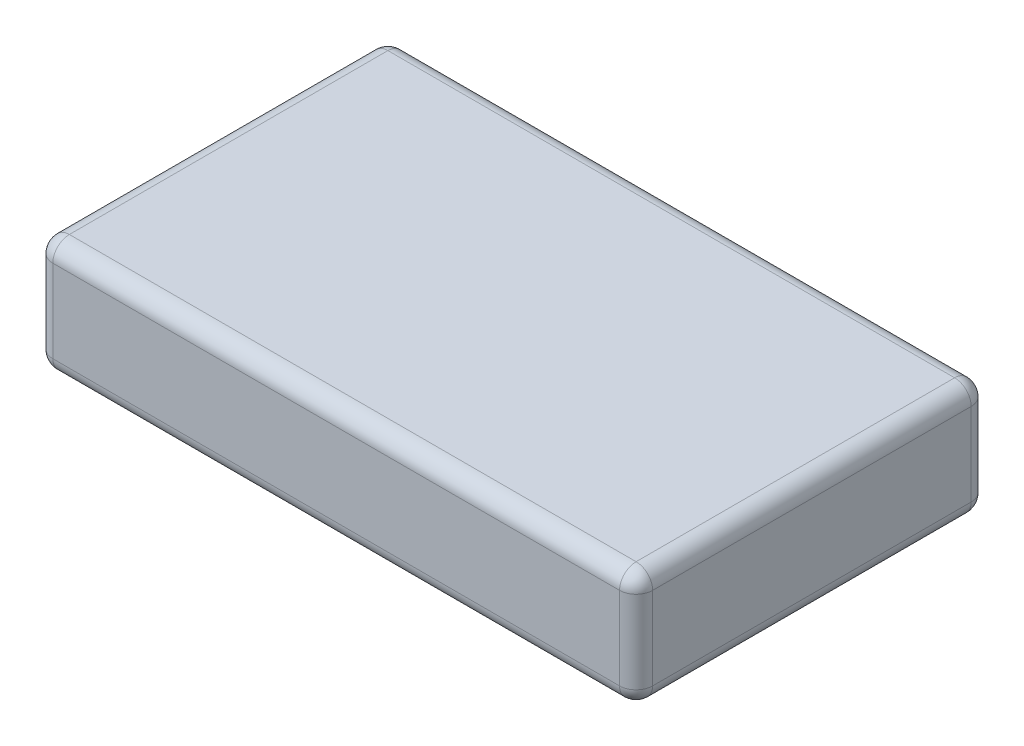
ISO-10303-21;
HEADER;
FILE_DESCRIPTION(('STEP AP214'),'2;1');
FILE_NAME('part.step','',(''),(''),'','','');
FILE_SCHEMA(('AUTOMOTIVE_DESIGN { 1 0 10303 214 1 1 1 1 }'));
ENDSEC;
DATA;
#1=APPLICATION_CONTEXT('core data for automotive mechanical design processes');
#2=APPLICATION_PROTOCOL_DEFINITION('international standard','automotive_design',2000,#1);
#3=PRODUCT_CONTEXT('',#1,'mechanical');
#4=PRODUCT('Part','Part','',(#3));
#5=PRODUCT_RELATED_PRODUCT_CATEGORY('part','',(#4));
#6=PRODUCT_DEFINITION_FORMATION('','',#4);
#7=PRODUCT_DEFINITION_CONTEXT('part definition',#1,'design');
#8=PRODUCT_DEFINITION('design','',#6,#7);
#9=PRODUCT_DEFINITION_SHAPE('','',#8);
#10=(LENGTH_UNIT() NAMED_UNIT(*) SI_UNIT(.MILLI.,.METRE.));
#11=(NAMED_UNIT(*) PLANE_ANGLE_UNIT() SI_UNIT($,.RADIAN.));
#12=(NAMED_UNIT(*) SI_UNIT($,.STERADIAN.) SOLID_ANGLE_UNIT());
#13=UNCERTAINTY_MEASURE_WITH_UNIT(LENGTH_MEASURE(1.E-05),#10,'distance_accuracy_value','');
#14=(GEOMETRIC_REPRESENTATION_CONTEXT(3) GLOBAL_UNCERTAINTY_ASSIGNED_CONTEXT((#13)) GLOBAL_UNIT_ASSIGNED_CONTEXT((#10,
#11,#12)) REPRESENTATION_CONTEXT('',''));
#15=CARTESIAN_POINT('',(0.,0.,0.));
#16=DIRECTION('',(0.,0.,1.));
#17=DIRECTION('',(1.,0.,0.));
#18=AXIS2_PLACEMENT_3D('',#15,#16,#17);
#19=CARTESIAN_POINT('',(72.5,28.,42.5));
#20=DIRECTION('',(-1.,0.,0.));
#21=DIRECTION('',(0.,0.,1.));
#22=AXIS2_PLACEMENT_3D('',#19,#20,#21);
#23=PLANE('',#22);
#24=DIRECTION('',(0.,0.,-1.));
#25=VECTOR('',#24,1.);
#26=CARTESIAN_POINT('',(72.5,4.,-42.5));
#27=LINE('',#26,#25);
#28=CARTESIAN_POINT('',(72.5,4.,38.5));
#29=VERTEX_POINT('',#28);
#30=CARTESIAN_POINT('',(72.5,4.,-38.5));
#31=VERTEX_POINT('',#30);
#32=EDGE_CURVE('E367',#29,#31,#27,.T.);
#33=ORIENTED_EDGE('',*,*,#32,.T.);
#34=DIRECTION('',(0.,-1.,0.));
#35=VECTOR('',#34,1.);
#36=CARTESIAN_POINT('',(72.5,28.,-38.5));
#37=LINE('',#36,#35);
#38=CARTESIAN_POINT('',(72.5,24.,-38.5));
#39=VERTEX_POINT('',#38);
#40=EDGE_CURVE('E416',#31,#39,#37,.F.);
#41=ORIENTED_EDGE('',*,*,#40,.T.);
#42=DIRECTION('',(0.,0.,-1.));
#43=VECTOR('',#42,1.);
#44=CARTESIAN_POINT('',(72.5,24.,42.5));
#45=LINE('',#44,#43);
#46=CARTESIAN_POINT('',(72.5,24.,38.5));
#47=VERTEX_POINT('',#46);
#48=EDGE_CURVE('E341',#39,#47,#45,.F.);
#49=ORIENTED_EDGE('',*,*,#48,.T.);
#50=DIRECTION('',(0.,-1.,0.));
#51=VECTOR('',#50,1.);
#52=CARTESIAN_POINT('',(72.5,28.,38.5));
#53=LINE('',#52,#51);
#54=EDGE_CURVE('E414',#47,#29,#53,.T.);
#55=ORIENTED_EDGE('',*,*,#54,.T.);
#56=EDGE_LOOP('',(#33,#41,#49,#55));
#57=FACE_BOUND('',#56,.T.);
#58=ADVANCED_FACE('F44',(#57),#23,.F.);
#59=CARTESIAN_POINT('',(-72.5,28.,-42.5));
#60=DIRECTION('',(0.,0.,1.));
#61=DIRECTION('',(1.,0.,0.));
#62=AXIS2_PLACEMENT_3D('',#59,#60,#61);
#63=PLANE('',#62);
#64=DIRECTION('',(-1.,0.,0.));
#65=VECTOR('',#64,1.);
#66=CARTESIAN_POINT('',(-72.5,24.,-42.5));
#67=LINE('',#66,#65);
#68=CARTESIAN_POINT('',(-68.5,24.,-42.5));
#69=VERTEX_POINT('',#68);
#70=CARTESIAN_POINT('',(68.5,24.,-42.5));
#71=VERTEX_POINT('',#70);
#72=EDGE_CURVE('E344',#69,#71,#67,.F.);
#73=ORIENTED_EDGE('',*,*,#72,.T.);
#74=DIRECTION('',(0.,-1.,0.));
#75=VECTOR('',#74,1.);
#76=CARTESIAN_POINT('',(68.5,28.,-42.5));
#77=LINE('',#76,#75);
#78=CARTESIAN_POINT('',(68.5,4.,-42.5));
#79=VERTEX_POINT('',#78);
#80=EDGE_CURVE('E412',#71,#79,#77,.T.);
#81=ORIENTED_EDGE('',*,*,#80,.T.);
#82=DIRECTION('',(-1.,0.,0.));
#83=VECTOR('',#82,1.);
#84=CARTESIAN_POINT('',(-72.5,4.,-42.5));
#85=LINE('',#84,#83);
#86=CARTESIAN_POINT('',(-68.5,4.,-42.5));
#87=VERTEX_POINT('',#86);
#88=EDGE_CURVE('E352',#79,#87,#85,.T.);
#89=ORIENTED_EDGE('',*,*,#88,.T.);
#90=DIRECTION('',(0.,-1.,0.));
#91=VECTOR('',#90,1.);
#92=CARTESIAN_POINT('',(-68.5,28.,-42.5));
#93=LINE('',#92,#91);
#94=EDGE_CURVE('E410',#87,#69,#93,.F.);
#95=ORIENTED_EDGE('',*,*,#94,.T.);
#96=EDGE_LOOP('',(#73,#81,#89,#95));
#97=FACE_BOUND('',#96,.T.);
#98=ADVANCED_FACE('F534',(#97),#63,.F.);
#99=CARTESIAN_POINT('',(-72.5,28.,42.5));
#100=DIRECTION('',(1.,0.,0.));
#101=DIRECTION('',(0.,0.,-1.));
#102=AXIS2_PLACEMENT_3D('',#99,#100,#101);
#103=PLANE('',#102);
#104=DIRECTION('',(0.,0.,-1.));
#105=VECTOR('',#104,1.);
#106=CARTESIAN_POINT('',(-72.5,18.91875,-28.875));
#107=LINE('',#106,#105);
#108=CARTESIAN_POINT('',(-72.5,18.91875,-24.375));
#109=VERTEX_POINT('',#108);
#110=CARTESIAN_POINT('',(-72.5,18.91875,-28.875));
#111=VERTEX_POINT('',#110);
#112=EDGE_CURVE('E301',#109,#111,#107,.T.);
#113=ORIENTED_EDGE('',*,*,#112,.F.);
#114=DIRECTION('',(0.,1.,0.));
#115=VECTOR('',#114,1.);
#116=CARTESIAN_POINT('',(-72.5,18.91875,-24.375));
#117=LINE('',#116,#115);
#118=CARTESIAN_POINT('',(-72.5,6.91875000000001,-24.375));
#119=VERTEX_POINT('',#118);
#120=EDGE_CURVE('E279',#119,#109,#117,.T.);
#121=ORIENTED_EDGE('',*,*,#120,.F.);
#122=DIRECTION('',(0.,0.,1.));
#123=VECTOR('',#122,1.);
#124=CARTESIAN_POINT('',(-72.5,6.91875000000001,-28.875));
#125=LINE('',#124,#123);
#126=CARTESIAN_POINT('',(-72.5,6.91875000000001,-28.875));
#127=VERTEX_POINT('',#126);
#128=EDGE_CURVE('E290',#127,#119,#125,.T.);
#129=ORIENTED_EDGE('',*,*,#128,.F.);
#130=DIRECTION('',(0.,-1.,0.));
#131=VECTOR('',#130,1.);
#132=CARTESIAN_POINT('',(-72.5,18.91875,-28.875));
#133=LINE('',#132,#131);
#134=EDGE_CURVE('E304',#111,#127,#133,.T.);
#135=ORIENTED_EDGE('',*,*,#134,.F.);
#136=EDGE_LOOP('',(#113,#121,#129,#135));
#137=FACE_BOUND('',#136,.T.);
#138=CARTESIAN_POINT('',(-72.5,12.4,25.2));
#139=DIRECTION('',(-1.,0.,0.));
#140=DIRECTION('',(0.,0.,1.));
#141=AXIS2_PLACEMENT_3D('',#138,#139,#140);
#142=CIRCLE('',#141,2.75);
#143=CARTESIAN_POINT('',(-72.5,12.4,27.95));
#144=VERTEX_POINT('',#143);
#145=EDGE_CURVE('E321',#144,#144,#142,.T.);
#146=ORIENTED_EDGE('',*,*,#145,.F.);
#147=EDGE_LOOP('',(#146));
#148=FACE_BOUND('',#147,.T.);
#149=DIRECTION('',(0.,0.,1.));
#150=VECTOR('',#149,1.);
#151=CARTESIAN_POINT('',(-72.5,4.,42.5));
#152=LINE('',#151,#150);
#153=CARTESIAN_POINT('',(-72.5,4.,-38.5));
#154=VERTEX_POINT('',#153);
#155=CARTESIAN_POINT('',(-72.5,4.,38.5));
#156=VERTEX_POINT('',#155);
#157=EDGE_CURVE('E373',#154,#156,#152,.T.);
#158=ORIENTED_EDGE('',*,*,#157,.T.);
#159=DIRECTION('',(0.,-1.,0.));
#160=VECTOR('',#159,1.);
#161=CARTESIAN_POINT('',(-72.5,28.,38.5));
#162=LINE('',#161,#160);
#163=CARTESIAN_POINT('',(-72.5,24.,38.5));
#164=VERTEX_POINT('',#163);
#165=EDGE_CURVE('E11',#156,#164,#162,.F.);
#166=ORIENTED_EDGE('',*,*,#165,.T.);
#167=DIRECTION('',(0.,0.,1.));
#168=VECTOR('',#167,1.);
#169=CARTESIAN_POINT('',(-72.5,24.,42.5));
#170=LINE('',#169,#168);
#171=CARTESIAN_POINT('',(-72.5,24.,-38.5));
#172=VERTEX_POINT('',#171);
#173=EDGE_CURVE('E347',#164,#172,#170,.F.);
#174=ORIENTED_EDGE('',*,*,#173,.T.);
#175=DIRECTION('',(0.,-1.,0.));
#176=VECTOR('',#175,1.);
#177=CARTESIAN_POINT('',(-72.5,28.,-38.5));
#178=LINE('',#177,#176);
#179=EDGE_CURVE('E53',#172,#154,#178,.T.);
#180=ORIENTED_EDGE('',*,*,#179,.T.);
#181=EDGE_LOOP('',(#158,#166,#174,#180));
#182=FACE_BOUND('',#181,.T.);
#183=ADVANCED_FACE('F523',(#137,#148,#182),#103,.F.);
#184=CARTESIAN_POINT('',(-72.5,28.,42.5));
#185=DIRECTION('',(0.,0.,-1.));
#186=DIRECTION('',(-1.,0.,0.));
#187=AXIS2_PLACEMENT_3D('',#184,#185,#186);
#188=PLANE('',#187);
#189=DIRECTION('',(1.,0.,0.));
#190=VECTOR('',#189,1.);
#191=CARTESIAN_POINT('',(72.5,4.,42.5));
#192=LINE('',#191,#190);
#193=CARTESIAN_POINT('',(-68.5,4.,42.5));
#194=VERTEX_POINT('',#193);
#195=CARTESIAN_POINT('',(68.5,4.,42.5));
#196=VERTEX_POINT('',#195);
#197=EDGE_CURVE('E370',#194,#196,#192,.T.);
#198=ORIENTED_EDGE('',*,*,#197,.T.);
#199=DIRECTION('',(0.,-1.,0.));
#200=VECTOR('',#199,1.);
#201=CARTESIAN_POINT('',(68.5,28.,42.5));
#202=LINE('',#201,#200);
#203=CARTESIAN_POINT('',(68.5,24.,42.5));
#204=VERTEX_POINT('',#203);
#205=EDGE_CURVE('E420',#196,#204,#202,.F.);
#206=ORIENTED_EDGE('',*,*,#205,.T.);
#207=DIRECTION('',(1.,0.,0.));
#208=VECTOR('',#207,1.);
#209=CARTESIAN_POINT('',(-72.5,24.,42.5));
#210=LINE('',#209,#208);
#211=CARTESIAN_POINT('',(-68.5,24.,42.5));
#212=VERTEX_POINT('',#211);
#213=EDGE_CURVE('E349',#204,#212,#210,.F.);
#214=ORIENTED_EDGE('',*,*,#213,.T.);
#215=DIRECTION('',(0.,-1.,0.));
#216=VECTOR('',#215,1.);
#217=CARTESIAN_POINT('',(-68.5,28.,42.5));
#218=LINE('',#217,#216);
#219=EDGE_CURVE('E418',#212,#194,#218,.T.);
#220=ORIENTED_EDGE('',*,*,#219,.T.);
#221=EDGE_LOOP('',(#198,#206,#214,#220));
#222=FACE_BOUND('',#221,.T.);
#223=ADVANCED_FACE('F482',(#222),#188,.F.);
#224=CARTESIAN_POINT('',(0.,28.,0.));
#225=DIRECTION('',(0.,-1.,0.));
#226=DIRECTION('',(0.,0.,-1.));
#227=AXIS2_PLACEMENT_3D('',#224,#225,#226);
#228=PLANE('',#227);
#229=DIRECTION('',(1.,0.,0.));
#230=VECTOR('',#229,1.);
#231=CARTESIAN_POINT('',(0.,28.,38.5));
#232=LINE('',#231,#230);
#233=CARTESIAN_POINT('',(-68.5,28.,38.5));
#234=VERTEX_POINT('',#233);
#235=CARTESIAN_POINT('',(68.5,28.,38.5));
#236=VERTEX_POINT('',#235);
#237=EDGE_CURVE('E327',#234,#236,#232,.T.);
#238=ORIENTED_EDGE('',*,*,#237,.T.);
#239=DIRECTION('',(0.,0.,-1.));
#240=VECTOR('',#239,1.);
#241=CARTESIAN_POINT('',(68.5,28.,0.));
#242=LINE('',#241,#240);
#243=CARTESIAN_POINT('',(68.5,28.,-38.5));
#244=VERTEX_POINT('',#243);
#245=EDGE_CURVE('E338',#236,#244,#242,.T.);
#246=ORIENTED_EDGE('',*,*,#245,.T.);
#247=DIRECTION('',(-1.,0.,0.));
#248=VECTOR('',#247,1.);
#249=CARTESIAN_POINT('',(0.,28.,-38.5));
#250=LINE('',#249,#248);
#251=CARTESIAN_POINT('',(-68.5,28.,-38.5));
#252=VERTEX_POINT('',#251);
#253=EDGE_CURVE('E335',#244,#252,#250,.T.);
#254=ORIENTED_EDGE('',*,*,#253,.T.);
#255=DIRECTION('',(0.,0.,1.));
#256=VECTOR('',#255,1.);
#257=CARTESIAN_POINT('',(-68.5,28.,0.));
#258=LINE('',#257,#256);
#259=EDGE_CURVE('E332',#252,#234,#258,.T.);
#260=ORIENTED_EDGE('',*,*,#259,.T.);
#261=EDGE_LOOP('',(#238,#246,#254,#260));
#262=FACE_BOUND('',#261,.T.);
#263=ADVANCED_FACE('F510',(#262),#228,.F.);
#264=CARTESIAN_POINT('',(0.,0.,0.));
#265=DIRECTION('',(0.,-1.,0.));
#266=DIRECTION('',(0.,0.,-1.));
#267=AXIS2_PLACEMENT_3D('',#264,#265,#266);
#268=PLANE('',#267);
#269=DIRECTION('',(0.,0.,1.));
#270=VECTOR('',#269,1.);
#271=CARTESIAN_POINT('',(-68.5,0.,-42.5));
#272=LINE('',#271,#270);
#273=CARTESIAN_POINT('',(-68.5,0.,38.5));
#274=VERTEX_POINT('',#273);
#275=CARTESIAN_POINT('',(-68.5,0.,-38.5));
#276=VERTEX_POINT('',#275);
#277=EDGE_CURVE('E355',#274,#276,#272,.F.);
#278=ORIENTED_EDGE('',*,*,#277,.T.);
#279=DIRECTION('',(-1.,0.,0.));
#280=VECTOR('',#279,1.);
#281=CARTESIAN_POINT('',(72.5,0.,-38.5));
#282=LINE('',#281,#280);
#283=CARTESIAN_POINT('',(68.5,0.,-38.5));
#284=VERTEX_POINT('',#283);
#285=EDGE_CURVE('E364',#276,#284,#282,.F.);
#286=ORIENTED_EDGE('',*,*,#285,.T.);
#287=DIRECTION('',(0.,0.,-1.));
#288=VECTOR('',#287,1.);
#289=CARTESIAN_POINT('',(68.5,0.,42.5));
#290=LINE('',#289,#288);
#291=CARTESIAN_POINT('',(68.5,0.,38.5));
#292=VERTEX_POINT('',#291);
#293=EDGE_CURVE('E361',#284,#292,#290,.F.);
#294=ORIENTED_EDGE('',*,*,#293,.T.);
#295=DIRECTION('',(1.,0.,0.));
#296=VECTOR('',#295,1.);
#297=CARTESIAN_POINT('',(-72.5,0.,38.5));
#298=LINE('',#297,#296);
#299=EDGE_CURVE('E358',#292,#274,#298,.F.);
#300=ORIENTED_EDGE('',*,*,#299,.T.);
#301=EDGE_LOOP('',(#278,#286,#294,#300));
#302=FACE_BOUND('',#301,.T.);
#303=ADVANCED_FACE('F453',(#302),#268,.T.);
#304=CARTESIAN_POINT('',(-63.5,12.4,25.2));
#305=DIRECTION('',(-1.,0.,0.));
#306=DIRECTION('',(0.,0.,1.));
#307=AXIS2_PLACEMENT_3D('',#304,#305,#306);
#308=CYLINDRICAL_SURFACE('',#307,2.75);
#309=CARTESIAN_POINT('',(-63.5,12.4,25.2));
#310=DIRECTION('',(-1.,0.,0.));
#311=DIRECTION('',(0.,0.,1.));
#312=AXIS2_PLACEMENT_3D('',#309,#310,#311);
#313=CIRCLE('',#312,2.75);
#314=CARTESIAN_POINT('',(-63.5,12.4,27.95));
#315=VERTEX_POINT('',#314);
#316=EDGE_CURVE('E324',#315,#315,#313,.T.);
#317=ORIENTED_EDGE('',*,*,#316,.F.);
#318=EDGE_LOOP('',(#317));
#319=FACE_BOUND('',#318,.T.);
#320=ORIENTED_EDGE('',*,*,#145,.T.);
#321=EDGE_LOOP('',(#320));
#322=FACE_BOUND('',#321,.T.);
#323=ADVANCED_FACE('F843',(#319,#322),#308,.F.);
#324=CARTESIAN_POINT('',(-63.5,12.4,25.2));
#325=DIRECTION('',(-1.,0.,0.));
#326=DIRECTION('',(0.,0.,1.));
#327=AXIS2_PLACEMENT_3D('',#324,#325,#326);
#328=PLANE('',#327);
#329=CARTESIAN_POINT('',(-63.5,12.4,25.2));
#330=DIRECTION('',(-1.,0.,0.));
#331=DIRECTION('',(0.,0.,1.));
#332=AXIS2_PLACEMENT_3D('',#329,#330,#331);
#333=CIRCLE('',#332,0.499999999999999);
#334=CARTESIAN_POINT('',(-63.5,12.4,25.7));
#335=VERTEX_POINT('',#334);
#336=EDGE_CURVE('E318',#335,#335,#333,.T.);
#337=ORIENTED_EDGE('',*,*,#336,.F.);
#338=EDGE_LOOP('',(#337));
#339=FACE_BOUND('',#338,.T.);
#340=ORIENTED_EDGE('',*,*,#316,.T.);
#341=EDGE_LOOP('',(#340));
#342=FACE_BOUND('',#341,.T.);
#343=ADVANCED_FACE('F834',(#339,#342),#328,.T.);
#344=CARTESIAN_POINT('',(-63.5,12.4,25.2));
#345=DIRECTION('',(-1.,0.,0.));
#346=DIRECTION('',(0.,0.,1.));
#347=AXIS2_PLACEMENT_3D('',#344,#345,#346);
#348=CYLINDRICAL_SURFACE('',#347,0.499999999999999);
#349=ORIENTED_EDGE('',*,*,#336,.T.);
#350=EDGE_LOOP('',(#349));
#351=FACE_BOUND('',#350,.T.);
#352=CARTESIAN_POINT('',(-72.5,12.4,25.2));
#353=DIRECTION('',(-1.,0.,0.));
#354=DIRECTION('',(0.,0.,1.));
#355=AXIS2_PLACEMENT_3D('',#352,#353,#354);
#356=CIRCLE('',#355,0.499999999999999);
#357=CARTESIAN_POINT('',(-72.5,12.4,25.7));
#358=VERTEX_POINT('',#357);
#359=EDGE_CURVE('E311',#358,#358,#356,.T.);
#360=ORIENTED_EDGE('',*,*,#359,.F.);
#361=EDGE_LOOP('',(#360));
#362=FACE_BOUND('',#361,.T.);
#363=ADVANCED_FACE('F830',(#351,#362),#348,.T.);
#364=ORIENTED_EDGE('',*,*,#359,.T.);
#365=EDGE_LOOP('',(#364));
#366=FACE_BOUND('',#365,.T.);
#367=ADVANCED_FACE('F809',(#366),#103,.F.);
#368=CARTESIAN_POINT('',(-63.5,18.91875,-24.375));
#369=DIRECTION('',(0.,0.,1.));
#370=DIRECTION('',(1.,0.,0.));
#371=AXIS2_PLACEMENT_3D('',#368,#369,#370);
#372=PLANE('',#371);
#373=ORIENTED_EDGE('',*,*,#120,.T.);
#374=DIRECTION('',(-1.,0.,0.));
#375=VECTOR('',#374,1.);
#376=CARTESIAN_POINT('',(-63.5,18.91875,-24.375));
#377=LINE('',#376,#375);
#378=CARTESIAN_POINT('',(-63.5,18.91875,-24.375));
#379=VERTEX_POINT('',#378);
#380=EDGE_CURVE('E299',#379,#109,#377,.T.);
#381=ORIENTED_EDGE('',*,*,#380,.F.);
#382=DIRECTION('',(0.,1.,0.));
#383=VECTOR('',#382,1.);
#384=CARTESIAN_POINT('',(-63.5,18.91875,-24.375));
#385=LINE('',#384,#383);
#386=CARTESIAN_POINT('',(-63.5,6.91875000000001,-24.375));
#387=VERTEX_POINT('',#386);
#388=EDGE_CURVE('E286',#387,#379,#385,.T.);
#389=ORIENTED_EDGE('',*,*,#388,.F.);
#390=DIRECTION('',(-1.,0.,0.));
#391=VECTOR('',#390,1.);
#392=CARTESIAN_POINT('',(-63.5,6.91875000000001,-24.375));
#393=LINE('',#392,#391);
#394=EDGE_CURVE('E309',#387,#119,#393,.T.);
#395=ORIENTED_EDGE('',*,*,#394,.T.);
#396=EDGE_LOOP('',(#373,#381,#389,#395));
#397=FACE_BOUND('',#396,.T.);
#398=ADVANCED_FACE('F800',(#397),#372,.F.);
#399=CARTESIAN_POINT('',(-63.5,6.91875000000001,-28.875));
#400=DIRECTION('',(0.,-1.,0.));
#401=DIRECTION('',(0.,0.,-1.));
#402=AXIS2_PLACEMENT_3D('',#399,#400,#401);
#403=PLANE('',#402);
#404=ORIENTED_EDGE('',*,*,#128,.T.);
#405=ORIENTED_EDGE('',*,*,#394,.F.);
#406=DIRECTION('',(0.,0.,1.));
#407=VECTOR('',#406,1.);
#408=CARTESIAN_POINT('',(-63.5,6.91875000000001,-28.875));
#409=LINE('',#408,#407);
#410=CARTESIAN_POINT('',(-63.5,6.91875000000001,-28.875));
#411=VERTEX_POINT('',#410);
#412=EDGE_CURVE('E296',#411,#387,#409,.T.);
#413=ORIENTED_EDGE('',*,*,#412,.F.);
#414=DIRECTION('',(-1.,0.,0.));
#415=VECTOR('',#414,1.);
#416=CARTESIAN_POINT('',(-63.5,6.91875000000001,-28.875));
#417=LINE('',#416,#415);
#418=EDGE_CURVE('E312',#411,#127,#417,.T.);
#419=ORIENTED_EDGE('',*,*,#418,.T.);
#420=EDGE_LOOP('',(#404,#405,#413,#419));
#421=FACE_BOUND('',#420,.T.);
#422=ADVANCED_FACE('F791',(#421),#403,.F.);
#423=CARTESIAN_POINT('',(-63.5,18.91875,-28.875));
#424=DIRECTION('',(0.,0.,-1.));
#425=DIRECTION('',(-1.,0.,0.));
#426=AXIS2_PLACEMENT_3D('',#423,#424,#425);
#427=PLANE('',#426);
#428=ORIENTED_EDGE('',*,*,#134,.T.);
#429=ORIENTED_EDGE('',*,*,#418,.F.);
#430=DIRECTION('',(0.,-1.,0.));
#431=VECTOR('',#430,1.);
#432=CARTESIAN_POINT('',(-63.5,18.91875,-28.875));
#433=LINE('',#432,#431);
#434=CARTESIAN_POINT('',(-63.5,18.91875,-28.875));
#435=VERTEX_POINT('',#434);
#436=EDGE_CURVE('E293',#435,#411,#433,.T.);
#437=ORIENTED_EDGE('',*,*,#436,.F.);
#438=DIRECTION('',(-1.,0.,0.));
#439=VECTOR('',#438,1.);
#440=CARTESIAN_POINT('',(-63.5,18.91875,-28.875));
#441=LINE('',#440,#439);
#442=EDGE_CURVE('E314',#435,#111,#441,.T.);
#443=ORIENTED_EDGE('',*,*,#442,.T.);
#444=EDGE_LOOP('',(#428,#429,#437,#443));
#445=FACE_BOUND('',#444,.T.);
#446=ADVANCED_FACE('F782',(#445),#427,.F.);
#447=CARTESIAN_POINT('',(-63.5,18.91875,-28.875));
#448=DIRECTION('',(0.,1.,0.));
#449=DIRECTION('',(0.,0.,1.));
#450=AXIS2_PLACEMENT_3D('',#447,#448,#449);
#451=PLANE('',#450);
#452=ORIENTED_EDGE('',*,*,#112,.T.);
#453=ORIENTED_EDGE('',*,*,#442,.F.);
#454=DIRECTION('',(0.,0.,-1.));
#455=VECTOR('',#454,1.);
#456=CARTESIAN_POINT('',(-63.5,18.91875,-28.875));
#457=LINE('',#456,#455);
#458=EDGE_CURVE('E289',#379,#435,#457,.T.);
#459=ORIENTED_EDGE('',*,*,#458,.F.);
#460=ORIENTED_EDGE('',*,*,#380,.T.);
#461=EDGE_LOOP('',(#452,#453,#459,#460));
#462=FACE_BOUND('',#461,.T.);
#463=ADVANCED_FACE('F774',(#462),#451,.F.);
#464=CARTESIAN_POINT('',(-63.5,0.,0.));
#465=DIRECTION('',(-1.,0.,0.));
#466=DIRECTION('',(0.,0.,1.));
#467=AXIS2_PLACEMENT_3D('',#464,#465,#466);
#468=PLANE('',#467);
#469=DIRECTION('',(0.,0.,1.));
#470=VECTOR('',#469,1.);
#471=CARTESIAN_POINT('',(-63.5,9.41875000000001,-28.0464474784729));
#472=LINE('',#471,#470);
#473=CARTESIAN_POINT('',(-63.5,9.41875000000001,-28.0464474784729));
#474=VERTEX_POINT('',#473);
#475=CARTESIAN_POINT('',(-63.5,9.41875000000001,-27.1807732580422));
#476=VERTEX_POINT('',#475);
#477=EDGE_CURVE('E219',#474,#476,#472,.T.);
#478=ORIENTED_EDGE('',*,*,#477,.F.);
#479=DIRECTION('',(0.,-1.,0.));
#480=VECTOR('',#479,1.);
#481=CARTESIAN_POINT('',(-63.5,16.41875,-28.0464474784729));
#482=LINE('',#481,#480);
#483=CARTESIAN_POINT('',(-63.5,16.41875,-28.0464474784729));
#484=VERTEX_POINT('',#483);
#485=EDGE_CURVE('E229',#484,#474,#482,.T.);
#486=ORIENTED_EDGE('',*,*,#485,.F.);
#487=DIRECTION('',(0.,0.,-1.));
#488=VECTOR('',#487,1.);
#489=CARTESIAN_POINT('',(-63.5,16.41875,-28.0464474784729));
#490=LINE('',#489,#488);
#491=CARTESIAN_POINT('',(-63.5,16.41875,-27.1807732580422));
#492=VERTEX_POINT('',#491);
#493=EDGE_CURVE('E211',#492,#484,#490,.T.);
#494=ORIENTED_EDGE('',*,*,#493,.F.);
#495=DIRECTION('',(0.,1.,0.));
#496=VECTOR('',#495,1.);
#497=CARTESIAN_POINT('',(-63.5,16.41875,-27.1807732580422));
#498=LINE('',#497,#496);
#499=EDGE_CURVE('E226',#476,#492,#498,.T.);
#500=ORIENTED_EDGE('',*,*,#499,.F.);
#501=EDGE_LOOP('',(#478,#486,#494,#500));
#502=FACE_BOUND('',#501,.T.);
#503=DIRECTION('',(0.,0.,1.));
#504=VECTOR('',#503,1.);
#505=CARTESIAN_POINT('',(-63.5,8.00087439647318,-26.7807966486774));
#506=LINE('',#505,#504);
#507=CARTESIAN_POINT('',(-63.5,8.00087439647318,-26.7807966486774));
#508=VERTEX_POINT('',#507);
#509=CARTESIAN_POINT('',(-63.5,8.00087439647318,-24.7807966486774));
#510=VERTEX_POINT('',#509);
#511=EDGE_CURVE('E263',#508,#510,#506,.T.);
#512=ORIENTED_EDGE('',*,*,#511,.F.);
#513=DIRECTION('',(0.,-1.,0.));
#514=VECTOR('',#513,1.);
#515=CARTESIAN_POINT('',(-63.5,17.8366256035268,-26.7807966486774));
#516=LINE('',#515,#514);
#517=CARTESIAN_POINT('',(-63.5,17.8366256035268,-26.7807966486774));
#518=VERTEX_POINT('',#517);
#519=EDGE_CURVE('E260',#518,#508,#516,.T.);
#520=ORIENTED_EDGE('',*,*,#519,.F.);
#521=DIRECTION('',(0.,0.,-1.));
#522=VECTOR('',#521,1.);
#523=CARTESIAN_POINT('',(-63.5,17.8366256035268,-26.7807966486774));
#524=LINE('',#523,#522);
#525=CARTESIAN_POINT('',(-63.5,17.8366256035268,-24.7807966486774));
#526=VERTEX_POINT('',#525);
#527=EDGE_CURVE('E256',#526,#518,#524,.T.);
#528=ORIENTED_EDGE('',*,*,#527,.F.);
#529=DIRECTION('',(0.,1.,0.));
#530=VECTOR('',#529,1.);
#531=CARTESIAN_POINT('',(-63.5,17.8366256035268,-24.7807966486774));
#532=LINE('',#531,#530);
#533=EDGE_CURVE('E253',#510,#526,#532,.T.);
#534=ORIENTED_EDGE('',*,*,#533,.F.);
#535=EDGE_LOOP('',(#512,#520,#528,#534));
#536=FACE_BOUND('',#535,.T.);
#537=ORIENTED_EDGE('',*,*,#388,.T.);
#538=ORIENTED_EDGE('',*,*,#458,.T.);
#539=ORIENTED_EDGE('',*,*,#436,.T.);
#540=ORIENTED_EDGE('',*,*,#412,.T.);
#541=EDGE_LOOP('',(#537,#538,#539,#540));
#542=FACE_BOUND('',#541,.T.);
#543=ADVANCED_FACE('F224',(#502,#536,#542),#468,.T.);
#544=CARTESIAN_POINT('',(-63.5,17.8366256035268,-24.7807966486774));
#545=DIRECTION('',(0.,0.,1.));
#546=DIRECTION('',(0.,-1.,0.));
#547=AXIS2_PLACEMENT_3D('',#544,#545,#546);
#548=PLANE('',#547);
#549=DIRECTION('',(0.,1.,0.));
#550=VECTOR('',#549,1.);
#551=CARTESIAN_POINT('',(-72.5,17.8366256035268,-24.7807966486774));
#552=LINE('',#551,#550);
#553=CARTESIAN_POINT('',(-72.5,8.00087439647318,-24.7807966486774));
#554=VERTEX_POINT('',#553);
#555=CARTESIAN_POINT('',(-72.5,17.8366256035268,-24.7807966486774));
#556=VERTEX_POINT('',#555);
#557=EDGE_CURVE('E249',#554,#556,#552,.T.);
#558=ORIENTED_EDGE('',*,*,#557,.F.);
#559=DIRECTION('',(-1.,0.,0.));
#560=VECTOR('',#559,1.);
#561=CARTESIAN_POINT('',(-63.5,8.00087439647318,-24.7807966486774));
#562=LINE('',#561,#560);
#563=EDGE_CURVE('E277',#510,#554,#562,.T.);
#564=ORIENTED_EDGE('',*,*,#563,.F.);
#565=ORIENTED_EDGE('',*,*,#533,.T.);
#566=DIRECTION('',(-1.,0.,0.));
#567=VECTOR('',#566,1.);
#568=CARTESIAN_POINT('',(-63.5,17.8366256035268,-24.7807966486774));
#569=LINE('',#568,#567);
#570=EDGE_CURVE('E266',#526,#556,#569,.T.);
#571=ORIENTED_EDGE('',*,*,#570,.T.);
#572=EDGE_LOOP('',(#558,#564,#565,#571));
#573=FACE_BOUND('',#572,.T.);
#574=ADVANCED_FACE('F757',(#573),#548,.T.);
#575=CARTESIAN_POINT('',(-63.5,8.00087439647318,-26.7807966486774));
#576=DIRECTION('',(0.,-1.,0.));
#577=DIRECTION('',(0.,0.,-1.));
#578=AXIS2_PLACEMENT_3D('',#575,#576,#577);
#579=PLANE('',#578);
#580=DIRECTION('',(0.,0.,1.));
#581=VECTOR('',#580,1.);
#582=CARTESIAN_POINT('',(-72.5,8.00087439647318,-26.7807966486774));
#583=LINE('',#582,#581);
#584=CARTESIAN_POINT('',(-72.5,8.00087439647318,-26.7807966486774));
#585=VERTEX_POINT('',#584);
#586=EDGE_CURVE('E257',#585,#554,#583,.T.);
#587=ORIENTED_EDGE('',*,*,#586,.F.);
#588=DIRECTION('',(-1.,0.,0.));
#589=VECTOR('',#588,1.);
#590=CARTESIAN_POINT('',(-63.5,8.00087439647318,-26.7807966486774));
#591=LINE('',#590,#589);
#592=EDGE_CURVE('E280',#508,#585,#591,.T.);
#593=ORIENTED_EDGE('',*,*,#592,.F.);
#594=ORIENTED_EDGE('',*,*,#511,.T.);
#595=ORIENTED_EDGE('',*,*,#563,.T.);
#596=EDGE_LOOP('',(#587,#593,#594,#595));
#597=FACE_BOUND('',#596,.T.);
#598=ADVANCED_FACE('F748',(#597),#579,.T.);
#599=CARTESIAN_POINT('',(-63.5,17.8366256035268,-26.7807966486774));
#600=DIRECTION('',(0.,0.,-1.));
#601=DIRECTION('',(-1.,0.,0.));
#602=AXIS2_PLACEMENT_3D('',#599,#600,#601);
#603=PLANE('',#602);
#604=DIRECTION('',(0.,-1.,0.));
#605=VECTOR('',#604,1.);
#606=CARTESIAN_POINT('',(-72.5,17.8366256035268,-26.7807966486774));
#607=LINE('',#606,#605);
#608=CARTESIAN_POINT('',(-72.5,17.8366256035268,-26.7807966486774));
#609=VERTEX_POINT('',#608);
#610=EDGE_CURVE('E272',#609,#585,#607,.T.);
#611=ORIENTED_EDGE('',*,*,#610,.F.);
#612=DIRECTION('',(-1.,0.,0.));
#613=VECTOR('',#612,1.);
#614=CARTESIAN_POINT('',(-63.5,17.8366256035268,-26.7807966486774));
#615=LINE('',#614,#613);
#616=EDGE_CURVE('E282',#518,#609,#615,.T.);
#617=ORIENTED_EDGE('',*,*,#616,.F.);
#618=ORIENTED_EDGE('',*,*,#519,.T.);
#619=ORIENTED_EDGE('',*,*,#592,.T.);
#620=EDGE_LOOP('',(#611,#617,#618,#619));
#621=FACE_BOUND('',#620,.T.);
#622=ADVANCED_FACE('F739',(#621),#603,.T.);
#623=CARTESIAN_POINT('',(-63.5,17.8366256035268,-26.7807966486774));
#624=DIRECTION('',(0.,1.,0.));
#625=DIRECTION('',(0.,0.,1.));
#626=AXIS2_PLACEMENT_3D('',#623,#624,#625);
#627=PLANE('',#626);
#628=DIRECTION('',(0.,0.,-1.));
#629=VECTOR('',#628,1.);
#630=CARTESIAN_POINT('',(-72.5,17.8366256035268,-26.7807966486774));
#631=LINE('',#630,#629);
#632=EDGE_CURVE('E269',#556,#609,#631,.T.);
#633=ORIENTED_EDGE('',*,*,#632,.F.);
#634=ORIENTED_EDGE('',*,*,#570,.F.);
#635=ORIENTED_EDGE('',*,*,#527,.T.);
#636=ORIENTED_EDGE('',*,*,#616,.T.);
#637=EDGE_LOOP('',(#633,#634,#635,#636));
#638=FACE_BOUND('',#637,.T.);
#639=ADVANCED_FACE('F731',(#638),#627,.T.);
#640=CARTESIAN_POINT('',(-63.5,16.41875,-27.1807732580422));
#641=DIRECTION('',(0.,0.,1.));
#642=DIRECTION('',(1.,0.,0.));
#643=AXIS2_PLACEMENT_3D('',#640,#641,#642);
#644=PLANE('',#643);
#645=DIRECTION('',(0.,1.,0.));
#646=VECTOR('',#645,1.);
#647=CARTESIAN_POINT('',(-72.5,16.41875,-27.1807732580422));
#648=LINE('',#647,#646);
#649=CARTESIAN_POINT('',(-72.5,9.41875000000001,-27.1807732580422));
#650=VERTEX_POINT('',#649);
#651=CARTESIAN_POINT('',(-72.5,16.41875,-27.1807732580422));
#652=VERTEX_POINT('',#651);
#653=EDGE_CURVE('E242',#650,#652,#648,.T.);
#654=ORIENTED_EDGE('',*,*,#653,.F.);
#655=DIRECTION('',(-1.,0.,0.));
#656=VECTOR('',#655,1.);
#657=CARTESIAN_POINT('',(-63.5,9.41875000000001,-27.1807732580422));
#658=LINE('',#657,#656);
#659=EDGE_CURVE('E233',#476,#650,#658,.T.);
#660=ORIENTED_EDGE('',*,*,#659,.F.);
#661=ORIENTED_EDGE('',*,*,#499,.T.);
#662=DIRECTION('',(-1.,0.,0.));
#663=VECTOR('',#662,1.);
#664=CARTESIAN_POINT('',(-63.5,16.41875,-27.1807732580422));
#665=LINE('',#664,#663);
#666=EDGE_CURVE('E207',#492,#652,#665,.T.);
#667=ORIENTED_EDGE('',*,*,#666,.T.);
#668=EDGE_LOOP('',(#654,#660,#661,#667));
#669=FACE_BOUND('',#668,.T.);
#670=ADVANCED_FACE('F232',(#669),#644,.T.);
#671=CARTESIAN_POINT('',(-63.5,9.41875000000001,-28.0464474784729));
#672=DIRECTION('',(0.,-1.,0.));
#673=DIRECTION('',(0.,0.,-1.));
#674=AXIS2_PLACEMENT_3D('',#671,#672,#673);
#675=PLANE('',#674);
#676=DIRECTION('',(0.,0.,1.));
#677=VECTOR('',#676,1.);
#678=CARTESIAN_POINT('',(-72.5,9.41875000000001,-28.0464474784729));
#679=LINE('',#678,#677);
#680=CARTESIAN_POINT('',(-72.5,9.41875000000001,-28.0464474784729));
#681=VERTEX_POINT('',#680);
#682=EDGE_CURVE('E234',#681,#650,#679,.T.);
#683=ORIENTED_EDGE('',*,*,#682,.F.);
#684=DIRECTION('',(-1.,0.,0.));
#685=VECTOR('',#684,1.);
#686=CARTESIAN_POINT('',(-63.5,9.41875000000001,-28.0464474784729));
#687=LINE('',#686,#685);
#688=EDGE_CURVE('E250',#474,#681,#687,.T.);
#689=ORIENTED_EDGE('',*,*,#688,.F.);
#690=ORIENTED_EDGE('',*,*,#477,.T.);
#691=ORIENTED_EDGE('',*,*,#659,.T.);
#692=EDGE_LOOP('',(#683,#689,#690,#691));
#693=FACE_BOUND('',#692,.T.);
#694=ADVANCED_FACE('F714',(#693),#675,.T.);
#695=CARTESIAN_POINT('',(-63.5,16.41875,-28.0464474784729));
#696=DIRECTION('',(0.,0.,-1.));
#697=DIRECTION('',(-1.,0.,0.));
#698=AXIS2_PLACEMENT_3D('',#695,#696,#697);
#699=PLANE('',#698);
#700=DIRECTION('',(0.,-1.,0.));
#701=VECTOR('',#700,1.);
#702=CARTESIAN_POINT('',(-72.5,16.41875,-28.0464474784729));
#703=LINE('',#702,#701);
#704=CARTESIAN_POINT('',(-72.5,16.41875,-28.0464474784729));
#705=VERTEX_POINT('',#704);
#706=EDGE_CURVE('E237',#705,#681,#703,.T.);
#707=ORIENTED_EDGE('',*,*,#706,.F.);
#708=DIRECTION('',(-1.,0.,0.));
#709=VECTOR('',#708,1.);
#710=CARTESIAN_POINT('',(-63.5,16.41875,-28.0464474784729));
#711=LINE('',#710,#709);
#712=EDGE_CURVE('E218',#484,#705,#711,.T.);
#713=ORIENTED_EDGE('',*,*,#712,.F.);
#714=ORIENTED_EDGE('',*,*,#485,.T.);
#715=ORIENTED_EDGE('',*,*,#688,.T.);
#716=EDGE_LOOP('',(#707,#713,#714,#715));
#717=FACE_BOUND('',#716,.T.);
#718=ADVANCED_FACE('F706',(#717),#699,.T.);
#719=CARTESIAN_POINT('',(-63.5,16.41875,-28.0464474784729));
#720=DIRECTION('',(0.,1.,0.));
#721=DIRECTION('',(0.,0.,1.));
#722=AXIS2_PLACEMENT_3D('',#719,#720,#721);
#723=PLANE('',#722);
#724=DIRECTION('',(0.,0.,-1.));
#725=VECTOR('',#724,1.);
#726=CARTESIAN_POINT('',(-72.5,16.41875,-28.0464474784729));
#727=LINE('',#726,#725);
#728=EDGE_CURVE('E213',#652,#705,#727,.T.);
#729=ORIENTED_EDGE('',*,*,#728,.F.);
#730=ORIENTED_EDGE('',*,*,#666,.F.);
#731=ORIENTED_EDGE('',*,*,#493,.T.);
#732=ORIENTED_EDGE('',*,*,#712,.T.);
#733=EDGE_LOOP('',(#729,#730,#731,#732));
#734=FACE_BOUND('',#733,.T.);
#735=ADVANCED_FACE('F209',(#734),#723,.T.);
#736=ORIENTED_EDGE('',*,*,#557,.T.);
#737=ORIENTED_EDGE('',*,*,#632,.T.);
#738=ORIENTED_EDGE('',*,*,#610,.T.);
#739=ORIENTED_EDGE('',*,*,#586,.T.);
#740=EDGE_LOOP('',(#736,#737,#738,#739));
#741=FACE_BOUND('',#740,.T.);
#742=ADVANCED_FACE('F705',(#741),#103,.F.);
#743=ORIENTED_EDGE('',*,*,#653,.T.);
#744=ORIENTED_EDGE('',*,*,#728,.T.);
#745=ORIENTED_EDGE('',*,*,#706,.T.);
#746=ORIENTED_EDGE('',*,*,#682,.T.);
#747=EDGE_LOOP('',(#743,#744,#745,#746));
#748=FACE_BOUND('',#747,.T.);
#749=ADVANCED_FACE('F552',(#748),#103,.F.);
#750=CARTESIAN_POINT('',(-68.5,24.,0.));
#751=DIRECTION('',(0.,0.,1.));
#752=DIRECTION('',(1.,0.,0.));
#753=AXIS2_PLACEMENT_3D('',#750,#751,#752);
#754=CYLINDRICAL_SURFACE('',#753,4.);
#755=ORIENTED_EDGE('',*,*,#173,.F.);
#756=CARTESIAN_POINT('',(-68.5,24.,38.5));
#757=DIRECTION('',(0.,0.,1.));
#758=DIRECTION('',(1.,0.,0.));
#759=AXIS2_PLACEMENT_3D('',#756,#757,#758);
#760=CIRCLE('',#759,4.);
#761=EDGE_CURVE('E405',#164,#234,#760,.F.);
#762=ORIENTED_EDGE('',*,*,#761,.T.);
#763=ORIENTED_EDGE('',*,*,#259,.F.);
#764=CARTESIAN_POINT('',(-68.5,24.,-38.5));
#765=DIRECTION('',(0.,0.,1.));
#766=DIRECTION('',(1.,0.,0.));
#767=AXIS2_PLACEMENT_3D('',#764,#765,#766);
#768=CIRCLE('',#767,4.);
#769=EDGE_CURVE('E403',#252,#172,#768,.T.);
#770=ORIENTED_EDGE('',*,*,#769,.T.);
#771=EDGE_LOOP('',(#755,#762,#763,#770));
#772=FACE_BOUND('',#771,.T.);
#773=ADVANCED_FACE('F525',(#772),#754,.T.);
#774=CARTESIAN_POINT('',(0.,24.,38.5));
#775=DIRECTION('',(1.,0.,0.));
#776=DIRECTION('',(0.,0.,-1.));
#777=AXIS2_PLACEMENT_3D('',#774,#775,#776);
#778=CYLINDRICAL_SURFACE('',#777,4.);
#779=ORIENTED_EDGE('',*,*,#213,.F.);
#780=CARTESIAN_POINT('',(68.5,24.,38.5));
#781=DIRECTION('',(1.,0.,0.));
#782=DIRECTION('',(0.,0.,-1.));
#783=AXIS2_PLACEMENT_3D('',#780,#781,#782);
#784=CIRCLE('',#783,4.);
#785=EDGE_CURVE('E397',#204,#236,#784,.F.);
#786=ORIENTED_EDGE('',*,*,#785,.T.);
#787=ORIENTED_EDGE('',*,*,#237,.F.);
#788=CARTESIAN_POINT('',(-68.5,24.,38.5));
#789=DIRECTION('',(1.,0.,0.));
#790=DIRECTION('',(0.,0.,-1.));
#791=AXIS2_PLACEMENT_3D('',#788,#789,#790);
#792=CIRCLE('',#791,4.);
#793=EDGE_CURVE('E394',#234,#212,#792,.T.);
#794=ORIENTED_EDGE('',*,*,#793,.T.);
#795=EDGE_LOOP('',(#779,#786,#787,#794));
#796=FACE_BOUND('',#795,.T.);
#797=ADVANCED_FACE('F485',(#796),#778,.T.);
#798=CARTESIAN_POINT('',(0.,24.,-38.5));
#799=DIRECTION('',(-1.,0.,0.));
#800=DIRECTION('',(0.,0.,1.));
#801=AXIS2_PLACEMENT_3D('',#798,#799,#800);
#802=CYLINDRICAL_SURFACE('',#801,4.);
#803=ORIENTED_EDGE('',*,*,#253,.F.);
#804=CARTESIAN_POINT('',(68.5,24.,-38.5));
#805=DIRECTION('',(-1.,0.,0.));
#806=DIRECTION('',(0.,0.,1.));
#807=AXIS2_PLACEMENT_3D('',#804,#805,#806);
#808=CIRCLE('',#807,4.);
#809=EDGE_CURVE('E384',#244,#71,#808,.T.);
#810=ORIENTED_EDGE('',*,*,#809,.T.);
#811=ORIENTED_EDGE('',*,*,#72,.F.);
#812=CARTESIAN_POINT('',(-68.5,24.,-38.5));
#813=DIRECTION('',(-1.,0.,0.));
#814=DIRECTION('',(0.,0.,1.));
#815=AXIS2_PLACEMENT_3D('',#812,#813,#814);
#816=CIRCLE('',#815,4.);
#817=EDGE_CURVE('E381',#69,#252,#816,.F.);
#818=ORIENTED_EDGE('',*,*,#817,.T.);
#819=EDGE_LOOP('',(#803,#810,#811,#818));
#820=FACE_BOUND('',#819,.T.);
#821=ADVANCED_FACE('F506',(#820),#802,.T.);
#822=CARTESIAN_POINT('',(68.5,24.,0.));
#823=DIRECTION('',(0.,0.,-1.));
#824=DIRECTION('',(-1.,0.,0.));
#825=AXIS2_PLACEMENT_3D('',#822,#823,#824);
#826=CYLINDRICAL_SURFACE('',#825,4.);
#827=ORIENTED_EDGE('',*,*,#48,.F.);
#828=CARTESIAN_POINT('',(68.5,24.,-38.5));
#829=DIRECTION('',(0.,0.,-1.));
#830=DIRECTION('',(-1.,0.,0.));
#831=AXIS2_PLACEMENT_3D('',#828,#829,#830);
#832=CIRCLE('',#831,4.);
#833=EDGE_CURVE('E378',#39,#244,#832,.F.);
#834=ORIENTED_EDGE('',*,*,#833,.T.);
#835=ORIENTED_EDGE('',*,*,#245,.F.);
#836=CARTESIAN_POINT('',(68.5,24.,38.5));
#837=DIRECTION('',(0.,0.,-1.));
#838=DIRECTION('',(-1.,0.,0.));
#839=AXIS2_PLACEMENT_3D('',#836,#837,#838);
#840=CIRCLE('',#839,4.);
#841=EDGE_CURVE('E375',#236,#47,#840,.T.);
#842=ORIENTED_EDGE('',*,*,#841,.T.);
#843=EDGE_LOOP('',(#827,#834,#835,#842));
#844=FACE_BOUND('',#843,.T.);
#845=ADVANCED_FACE('F494',(#844),#826,.T.);
#846=CARTESIAN_POINT('',(-72.5,4.,38.5));
#847=DIRECTION('',(-1.,0.,0.));
#848=DIRECTION('',(0.,0.,1.));
#849=AXIS2_PLACEMENT_3D('',#846,#847,#848);
#850=CYLINDRICAL_SURFACE('',#849,4.);
#851=ORIENTED_EDGE('',*,*,#299,.F.);
#852=CARTESIAN_POINT('',(68.5,4.,38.5));
#853=DIRECTION('',(-1.,0.,0.));
#854=DIRECTION('',(0.,0.,1.));
#855=AXIS2_PLACEMENT_3D('',#852,#853,#854);
#856=CIRCLE('',#855,4.);
#857=EDGE_CURVE('E401',#292,#196,#856,.T.);
#858=ORIENTED_EDGE('',*,*,#857,.T.);
#859=ORIENTED_EDGE('',*,*,#197,.F.);
#860=CARTESIAN_POINT('',(-68.5,4.,38.5));
#861=DIRECTION('',(-1.,0.,0.));
#862=DIRECTION('',(0.,0.,1.));
#863=AXIS2_PLACEMENT_3D('',#860,#861,#862);
#864=CIRCLE('',#863,4.);
#865=EDGE_CURVE('E399',#194,#274,#864,.F.);
#866=ORIENTED_EDGE('',*,*,#865,.T.);
#867=EDGE_LOOP('',(#851,#858,#859,#866));
#868=FACE_BOUND('',#867,.T.);
#869=ADVANCED_FACE('F469',(#868),#850,.T.);
#870=CARTESIAN_POINT('',(68.5,4.,42.5));
#871=DIRECTION('',(0.,0.,1.));
#872=DIRECTION('',(1.,0.,0.));
#873=AXIS2_PLACEMENT_3D('',#870,#871,#872);
#874=CYLINDRICAL_SURFACE('',#873,4.);
#875=ORIENTED_EDGE('',*,*,#293,.F.);
#876=CARTESIAN_POINT('',(68.5,4.,-38.5));
#877=DIRECTION('',(0.,0.,1.));
#878=DIRECTION('',(1.,0.,0.));
#879=AXIS2_PLACEMENT_3D('',#876,#877,#878);
#880=CIRCLE('',#879,4.);
#881=EDGE_CURVE('E392',#284,#31,#880,.T.);
#882=ORIENTED_EDGE('',*,*,#881,.T.);
#883=ORIENTED_EDGE('',*,*,#32,.F.);
#884=CARTESIAN_POINT('',(68.5,4.,38.5));
#885=DIRECTION('',(0.,0.,1.));
#886=DIRECTION('',(1.,0.,0.));
#887=AXIS2_PLACEMENT_3D('',#884,#885,#886);
#888=CIRCLE('',#887,4.);
#889=EDGE_CURVE('E390',#29,#292,#888,.F.);
#890=ORIENTED_EDGE('',*,*,#889,.T.);
#891=EDGE_LOOP('',(#875,#882,#883,#890));
#892=FACE_BOUND('',#891,.T.);
#893=ADVANCED_FACE('F464',(#892),#874,.T.);
#894=CARTESIAN_POINT('',(-68.5,4.,42.5));
#895=DIRECTION('',(0.,0.,-1.));
#896=DIRECTION('',(-1.,0.,0.));
#897=AXIS2_PLACEMENT_3D('',#894,#895,#896);
#898=CYLINDRICAL_SURFACE('',#897,4.);
#899=ORIENTED_EDGE('',*,*,#277,.F.);
#900=CARTESIAN_POINT('',(-68.5,4.,38.5));
#901=DIRECTION('',(0.,0.,-1.));
#902=DIRECTION('',(-1.,0.,0.));
#903=AXIS2_PLACEMENT_3D('',#900,#901,#902);
#904=CIRCLE('',#903,4.);
#905=EDGE_CURVE('E61',#274,#156,#904,.T.);
#906=ORIENTED_EDGE('',*,*,#905,.T.);
#907=ORIENTED_EDGE('',*,*,#157,.F.);
#908=CARTESIAN_POINT('',(-68.5,4.,-38.5));
#909=DIRECTION('',(0.,0.,-1.));
#910=DIRECTION('',(-1.,0.,0.));
#911=AXIS2_PLACEMENT_3D('',#908,#909,#910);
#912=CIRCLE('',#911,4.);
#913=EDGE_CURVE('E407',#154,#276,#912,.F.);
#914=ORIENTED_EDGE('',*,*,#913,.T.);
#915=EDGE_LOOP('',(#899,#906,#907,#914));
#916=FACE_BOUND('',#915,.T.);
#917=ADVANCED_FACE('F450',(#916),#898,.T.);
#918=CARTESIAN_POINT('',(-72.5,4.,-38.5));
#919=DIRECTION('',(1.,0.,0.));
#920=DIRECTION('',(0.,0.,-1.));
#921=AXIS2_PLACEMENT_3D('',#918,#919,#920);
#922=CYLINDRICAL_SURFACE('',#921,4.);
#923=ORIENTED_EDGE('',*,*,#88,.F.);
#924=CARTESIAN_POINT('',(68.5,4.,-38.5));
#925=DIRECTION('',(1.,0.,0.));
#926=DIRECTION('',(0.,0.,-1.));
#927=AXIS2_PLACEMENT_3D('',#924,#925,#926);
#928=CIRCLE('',#927,4.);
#929=EDGE_CURVE('E388',#79,#284,#928,.F.);
#930=ORIENTED_EDGE('',*,*,#929,.T.);
#931=ORIENTED_EDGE('',*,*,#285,.F.);
#932=CARTESIAN_POINT('',(-68.5,4.,-38.5));
#933=DIRECTION('',(1.,0.,0.));
#934=DIRECTION('',(0.,0.,-1.));
#935=AXIS2_PLACEMENT_3D('',#932,#933,#934);
#936=CIRCLE('',#935,4.);
#937=EDGE_CURVE('E386',#276,#87,#936,.T.);
#938=ORIENTED_EDGE('',*,*,#937,.T.);
#939=EDGE_LOOP('',(#923,#930,#931,#938));
#940=FACE_BOUND('',#939,.T.);
#941=ADVANCED_FACE('F458',(#940),#922,.T.);
#942=CARTESIAN_POINT('',(68.5,4.,-38.5));
#943=DIRECTION('',(0.,0.,1.));
#944=DIRECTION('',(1.,0.,0.));
#945=AXIS2_PLACEMENT_3D('',#942,#943,#944);
#946=SPHERICAL_SURFACE('',#945,4.);
#947=ORIENTED_EDGE('',*,*,#881,.F.);
#948=ORIENTED_EDGE('',*,*,#929,.F.);
#949=CARTESIAN_POINT('',(68.5,4.,-38.5));
#950=DIRECTION('',(0.,1.,0.));
#951=DIRECTION('',(0.,0.,1.));
#952=AXIS2_PLACEMENT_3D('',#949,#950,#951);
#953=CIRCLE('',#952,4.);
#954=EDGE_CURVE('E244',#31,#79,#953,.T.);
#955=ORIENTED_EDGE('',*,*,#954,.F.);
#956=EDGE_LOOP('',(#947,#948,#955));
#957=FACE_BOUND('',#956,.T.);
#958=ADVANCED_FACE('F555',(#957),#946,.T.);
#959=CARTESIAN_POINT('',(68.5,28.,-38.5));
#960=DIRECTION('',(0.,-1.,0.));
#961=DIRECTION('',(0.,0.,-1.));
#962=AXIS2_PLACEMENT_3D('',#959,#960,#961);
#963=CYLINDRICAL_SURFACE('',#962,4.);
#964=ORIENTED_EDGE('',*,*,#954,.T.);
#965=ORIENTED_EDGE('',*,*,#80,.F.);
#966=CARTESIAN_POINT('',(68.5,24.,-38.5));
#967=DIRECTION('',(0.,1.,0.));
#968=DIRECTION('',(0.,0.,1.));
#969=AXIS2_PLACEMENT_3D('',#966,#967,#968);
#970=CIRCLE('',#969,4.);
#971=EDGE_CURVE('E423',#39,#71,#970,.T.);
#972=ORIENTED_EDGE('',*,*,#971,.F.);
#973=ORIENTED_EDGE('',*,*,#40,.F.);
#974=EDGE_LOOP('',(#964,#965,#972,#973));
#975=FACE_BOUND('',#974,.T.);
#976=ADVANCED_FACE('F499',(#975),#963,.T.);
#977=CARTESIAN_POINT('',(68.5,24.,-38.5));
#978=DIRECTION('',(0.,0.,1.));
#979=DIRECTION('',(1.,0.,0.));
#980=AXIS2_PLACEMENT_3D('',#977,#978,#979);
#981=SPHERICAL_SURFACE('',#980,4.);
#982=ORIENTED_EDGE('',*,*,#971,.T.);
#983=ORIENTED_EDGE('',*,*,#809,.F.);
#984=ORIENTED_EDGE('',*,*,#833,.F.);
#985=EDGE_LOOP('',(#982,#983,#984));
#986=FACE_BOUND('',#985,.T.);
#987=ADVANCED_FACE('F503',(#986),#981,.T.);
#988=CARTESIAN_POINT('',(68.5,4.,38.5));
#989=DIRECTION('',(0.,0.,1.));
#990=DIRECTION('',(1.,0.,0.));
#991=AXIS2_PLACEMENT_3D('',#988,#989,#990);
#992=SPHERICAL_SURFACE('',#991,4.);
#993=ORIENTED_EDGE('',*,*,#857,.F.);
#994=ORIENTED_EDGE('',*,*,#889,.F.);
#995=CARTESIAN_POINT('',(68.5,4.,38.5));
#996=DIRECTION('',(0.,1.,0.));
#997=DIRECTION('',(0.,0.,1.));
#998=AXIS2_PLACEMENT_3D('',#995,#996,#997);
#999=CIRCLE('',#998,4.);
#1000=EDGE_CURVE('E426',#196,#29,#999,.T.);
#1001=ORIENTED_EDGE('',*,*,#1000,.F.);
#1002=EDGE_LOOP('',(#993,#994,#1001));
#1003=FACE_BOUND('',#1002,.T.);
#1004=ADVANCED_FACE('F474',(#1003),#992,.T.);
#1005=CARTESIAN_POINT('',(68.5,28.,38.5));
#1006=DIRECTION('',(0.,-1.,0.));
#1007=DIRECTION('',(0.,0.,-1.));
#1008=AXIS2_PLACEMENT_3D('',#1005,#1006,#1007);
#1009=CYLINDRICAL_SURFACE('',#1008,4.);
#1010=ORIENTED_EDGE('',*,*,#1000,.T.);
#1011=ORIENTED_EDGE('',*,*,#54,.F.);
#1012=CARTESIAN_POINT('',(68.5,24.,38.5));
#1013=DIRECTION('',(0.,1.,0.));
#1014=DIRECTION('',(0.,0.,1.));
#1015=AXIS2_PLACEMENT_3D('',#1012,#1013,#1014);
#1016=CIRCLE('',#1015,4.);
#1017=EDGE_CURVE('E429',#204,#47,#1016,.T.);
#1018=ORIENTED_EDGE('',*,*,#1017,.F.);
#1019=ORIENTED_EDGE('',*,*,#205,.F.);
#1020=EDGE_LOOP('',(#1010,#1011,#1018,#1019));
#1021=FACE_BOUND('',#1020,.T.);
#1022=ADVANCED_FACE('F479',(#1021),#1009,.T.);
#1023=CARTESIAN_POINT('',(68.5,24.,38.5));
#1024=DIRECTION('',(0.,0.,1.));
#1025=DIRECTION('',(1.,0.,0.));
#1026=AXIS2_PLACEMENT_3D('',#1023,#1024,#1025);
#1027=SPHERICAL_SURFACE('',#1026,4.);
#1028=ORIENTED_EDGE('',*,*,#841,.F.);
#1029=ORIENTED_EDGE('',*,*,#785,.F.);
#1030=ORIENTED_EDGE('',*,*,#1017,.T.);
#1031=EDGE_LOOP('',(#1028,#1029,#1030));
#1032=FACE_BOUND('',#1031,.T.);
#1033=ADVANCED_FACE('F490',(#1032),#1027,.T.);
#1034=CARTESIAN_POINT('',(-68.5,4.,38.5));
#1035=DIRECTION('',(0.,0.,1.));
#1036=DIRECTION('',(1.,0.,0.));
#1037=AXIS2_PLACEMENT_3D('',#1034,#1035,#1036);
#1038=SPHERICAL_SURFACE('',#1037,4.);
#1039=ORIENTED_EDGE('',*,*,#905,.F.);
#1040=ORIENTED_EDGE('',*,*,#865,.F.);
#1041=CARTESIAN_POINT('',(-68.5,4.,38.5));
#1042=DIRECTION('',(0.,1.,0.));
#1043=DIRECTION('',(0.,0.,1.));
#1044=AXIS2_PLACEMENT_3D('',#1041,#1042,#1043);
#1045=CIRCLE('',#1044,4.);
#1046=EDGE_CURVE('E431',#156,#194,#1045,.T.);
#1047=ORIENTED_EDGE('',*,*,#1046,.F.);
#1048=EDGE_LOOP('',(#1039,#1040,#1047));
#1049=FACE_BOUND('',#1048,.T.);
#1050=ADVANCED_FACE('F521',(#1049),#1038,.T.);
#1051=CARTESIAN_POINT('',(-68.5,28.,38.5));
#1052=DIRECTION('',(0.,-1.,0.));
#1053=DIRECTION('',(0.,0.,-1.));
#1054=AXIS2_PLACEMENT_3D('',#1051,#1052,#1053);
#1055=CYLINDRICAL_SURFACE('',#1054,4.);
#1056=ORIENTED_EDGE('',*,*,#1046,.T.);
#1057=ORIENTED_EDGE('',*,*,#219,.F.);
#1058=CARTESIAN_POINT('',(-68.5,24.,38.5));
#1059=DIRECTION('',(0.,1.,0.));
#1060=DIRECTION('',(0.,0.,1.));
#1061=AXIS2_PLACEMENT_3D('',#1058,#1059,#1060);
#1062=CIRCLE('',#1061,4.);
#1063=EDGE_CURVE('E434',#164,#212,#1062,.T.);
#1064=ORIENTED_EDGE('',*,*,#1063,.F.);
#1065=ORIENTED_EDGE('',*,*,#165,.F.);
#1066=EDGE_LOOP('',(#1056,#1057,#1064,#1065));
#1067=FACE_BOUND('',#1066,.T.);
#1068=ADVANCED_FACE('F518',(#1067),#1055,.T.);
#1069=CARTESIAN_POINT('',(-68.5,24.,38.5));
#1070=DIRECTION('',(0.,0.,1.));
#1071=DIRECTION('',(1.,0.,0.));
#1072=AXIS2_PLACEMENT_3D('',#1069,#1070,#1071);
#1073=SPHERICAL_SURFACE('',#1072,4.);
#1074=ORIENTED_EDGE('',*,*,#793,.F.);
#1075=ORIENTED_EDGE('',*,*,#761,.F.);
#1076=ORIENTED_EDGE('',*,*,#1063,.T.);
#1077=EDGE_LOOP('',(#1074,#1075,#1076));
#1078=FACE_BOUND('',#1077,.T.);
#1079=ADVANCED_FACE('F513',(#1078),#1073,.T.);
#1080=CARTESIAN_POINT('',(-68.5,4.,-38.5));
#1081=DIRECTION('',(0.,0.,1.));
#1082=DIRECTION('',(1.,0.,0.));
#1083=AXIS2_PLACEMENT_3D('',#1080,#1081,#1082);
#1084=SPHERICAL_SURFACE('',#1083,4.);
#1085=ORIENTED_EDGE('',*,*,#937,.F.);
#1086=ORIENTED_EDGE('',*,*,#913,.F.);
#1087=CARTESIAN_POINT('',(-68.5,4.,-38.5));
#1088=DIRECTION('',(0.,1.,0.));
#1089=DIRECTION('',(0.,0.,1.));
#1090=AXIS2_PLACEMENT_3D('',#1087,#1088,#1089);
#1091=CIRCLE('',#1090,4.);
#1092=EDGE_CURVE('E48',#87,#154,#1091,.T.);
#1093=ORIENTED_EDGE('',*,*,#1092,.F.);
#1094=EDGE_LOOP('',(#1085,#1086,#1093));
#1095=FACE_BOUND('',#1094,.T.);
#1096=ADVANCED_FACE('F46',(#1095),#1084,.T.);
#1097=CARTESIAN_POINT('',(-68.5,28.,-38.5));
#1098=DIRECTION('',(0.,-1.,0.));
#1099=DIRECTION('',(0.,0.,-1.));
#1100=AXIS2_PLACEMENT_3D('',#1097,#1098,#1099);
#1101=CYLINDRICAL_SURFACE('',#1100,4.);
#1102=ORIENTED_EDGE('',*,*,#1092,.T.);
#1103=ORIENTED_EDGE('',*,*,#179,.F.);
#1104=CARTESIAN_POINT('',(-68.5,24.,-38.5));
#1105=DIRECTION('',(0.,1.,0.));
#1106=DIRECTION('',(0.,0.,1.));
#1107=AXIS2_PLACEMENT_3D('',#1104,#1105,#1106);
#1108=CIRCLE('',#1107,4.);
#1109=EDGE_CURVE('E437',#69,#172,#1108,.T.);
#1110=ORIENTED_EDGE('',*,*,#1109,.F.);
#1111=ORIENTED_EDGE('',*,*,#94,.F.);
#1112=EDGE_LOOP('',(#1102,#1103,#1110,#1111));
#1113=FACE_BOUND('',#1112,.T.);
#1114=ADVANCED_FACE('F446',(#1113),#1101,.T.);
#1115=CARTESIAN_POINT('',(-68.5,24.,-38.5));
#1116=DIRECTION('',(0.,0.,1.));
#1117=DIRECTION('',(1.,0.,0.));
#1118=AXIS2_PLACEMENT_3D('',#1115,#1116,#1117);
#1119=SPHERICAL_SURFACE('',#1118,4.);
#1120=ORIENTED_EDGE('',*,*,#1109,.T.);
#1121=ORIENTED_EDGE('',*,*,#769,.F.);
#1122=ORIENTED_EDGE('',*,*,#817,.F.);
#1123=EDGE_LOOP('',(#1120,#1121,#1122));
#1124=FACE_BOUND('',#1123,.T.);
#1125=ADVANCED_FACE('F526',(#1124),#1119,.T.);
#1126=CLOSED_SHELL('',(#58,#98,#183,#223,#263,#303,#323,#343,#363,#367,#398,#422,#446,#463,#543,
#574,#598,#622,#639,#670,#694,#718,#735,#742,#749,#773,#797,#821,#845,#869,#893,#917,#941,#958,
#976,#987,#1004,#1022,#1033,#1050,#1068,#1079,#1096,#1114,#1125));
#1127=MANIFOLD_SOLID_BREP('B2',#1126);
#1128=ADVANCED_BREP_SHAPE_REPRESENTATION('',(#18,#1127),#14);
#1129=SHAPE_DEFINITION_REPRESENTATION(#9,#1128);
ENDSEC;
END-ISO-10303-21;
